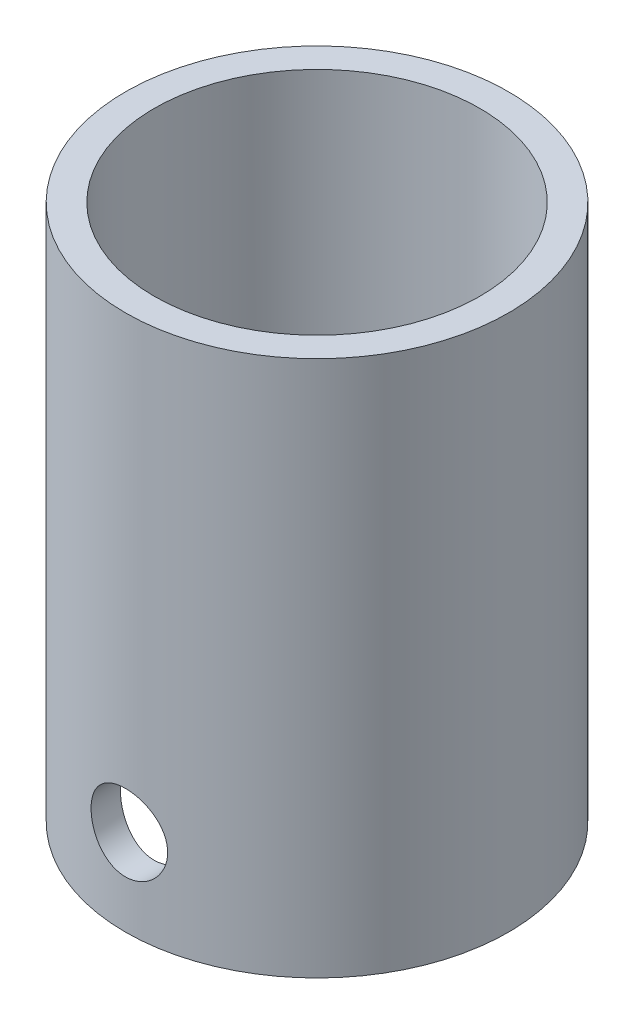
ISO-10303-21;
HEADER;
FILE_DESCRIPTION(('STEP AP214'),'2;1');
FILE_NAME('part.step','',(''),(''),'','','');
FILE_SCHEMA(('AUTOMOTIVE_DESIGN { 1 0 10303 214 1 1 1 1 }'));
ENDSEC;
DATA;
#1=APPLICATION_CONTEXT('core data for automotive mechanical design processes');
#2=APPLICATION_PROTOCOL_DEFINITION('international standard','automotive_design',2000,#1);
#3=PRODUCT_CONTEXT('',#1,'mechanical');
#4=PRODUCT('Part','Part','',(#3));
#5=PRODUCT_RELATED_PRODUCT_CATEGORY('part','',(#4));
#6=PRODUCT_DEFINITION_FORMATION('','',#4);
#7=PRODUCT_DEFINITION_CONTEXT('part definition',#1,'design');
#8=PRODUCT_DEFINITION('design','',#6,#7);
#9=PRODUCT_DEFINITION_SHAPE('','',#8);
#10=(LENGTH_UNIT() NAMED_UNIT(*) SI_UNIT(.MILLI.,.METRE.));
#11=(NAMED_UNIT(*) PLANE_ANGLE_UNIT() SI_UNIT($,.RADIAN.));
#12=(NAMED_UNIT(*) SI_UNIT($,.STERADIAN.) SOLID_ANGLE_UNIT());
#13=UNCERTAINTY_MEASURE_WITH_UNIT(LENGTH_MEASURE(1.E-05),#10,'distance_accuracy_value','');
#14=(GEOMETRIC_REPRESENTATION_CONTEXT(3) GLOBAL_UNCERTAINTY_ASSIGNED_CONTEXT((#13)) GLOBAL_UNIT_ASSIGNED_CONTEXT((#10,
#11,#12)) REPRESENTATION_CONTEXT('',''));
#15=CARTESIAN_POINT('',(0.,0.,0.));
#16=DIRECTION('',(0.,0.,1.));
#17=DIRECTION('',(1.,0.,0.));
#18=AXIS2_PLACEMENT_3D('',#15,#16,#17);
#19=CARTESIAN_POINT('',(0.,28.,0.));
#20=DIRECTION('',(0.,-1.,0.));
#21=DIRECTION('',(0.,0.,-1.));
#22=AXIS2_PLACEMENT_3D('',#19,#20,#21);
#23=CYLINDRICAL_SURFACE('',#22,10.);
#24=CARTESIAN_POINT('',(0.,28.,0.));
#25=DIRECTION('',(0.,1.,0.));
#26=DIRECTION('',(0.,0.,1.));
#27=AXIS2_PLACEMENT_3D('',#24,#25,#26);
#28=CIRCLE('',#27,10.);
#29=CARTESIAN_POINT('',(0.,28.,10.));
#30=VERTEX_POINT('',#29);
#31=EDGE_CURVE('E10',#30,#30,#28,.T.);
#32=ORIENTED_EDGE('',*,*,#31,.F.);
#33=EDGE_LOOP('',(#32));
#34=FACE_BOUND('',#33,.T.);
#35=CARTESIAN_POINT('',(0.,0.,0.));
#36=DIRECTION('',(0.,1.,0.));
#37=DIRECTION('',(0.,0.,1.));
#38=AXIS2_PLACEMENT_3D('',#35,#36,#37);
#39=CIRCLE('',#38,10.);
#40=CARTESIAN_POINT('',(0.,0.,10.));
#41=VERTEX_POINT('',#40);
#42=EDGE_CURVE('E45',#41,#41,#39,.T.);
#43=ORIENTED_EDGE('',*,*,#42,.T.);
#44=EDGE_LOOP('',(#43));
#45=FACE_BOUND('',#44,.T.);
#46=CARTESIAN_POINT('',(0.,2.5,10.));
#47=CARTESIAN_POINT('',(0.111153813585266,2.50000408899669,9.99999795161742));
#48=CARTESIAN_POINT('',(0.222359320403045,2.50929768593529,9.99812770356462));
#49=CARTESIAN_POINT('',(0.441627015378038,2.54619700023049,9.99084731246463));
#50=CARTESIAN_POINT('',(0.549686635082711,2.57381726560302,9.98543435720372));
#51=CARTESIAN_POINT('',(0.759460610526626,2.64648254724158,9.97167298556573));
#52=CARTESIAN_POINT('',(0.861180935866268,2.69151087368938,9.96332738153436));
#53=CARTESIAN_POINT('',(1.05561597772845,2.79766449502259,9.94460796070629));
#54=CARTESIAN_POINT('',(1.14833123015162,2.85878883121441,9.93423426471414));
#55=CARTESIAN_POINT('',(1.32338695462973,2.99627698858287,9.9124433065994));
#56=CARTESIAN_POINT('',(1.40558790231705,3.0728167107824,9.90101491008695));
#57=CARTESIAN_POINT('',(1.55607351321606,3.2385848327834,9.87848360905177));
#58=CARTESIAN_POINT('',(1.62435708954085,3.32781422267024,9.86738073000848));
#59=CARTESIAN_POINT('',(1.74566350669524,3.51743238602375,9.8466488362523));
#60=CARTESIAN_POINT('',(1.79854187773173,3.61791528759272,9.83703414729892));
#61=CARTESIAN_POINT('',(1.88661133316062,3.82656363800816,9.82052536116836));
#62=CARTESIAN_POINT('',(1.92180416487448,3.93472832669269,9.81363099523923));
#63=CARTESIAN_POINT('',(1.97305059976965,4.15416872781583,9.80345610504409));
#64=CARTESIAN_POINT('',(1.98934899591755,4.26538508828445,9.80012940214375));
#65=CARTESIAN_POINT('',(2.00310425545224,4.48901964272869,9.79732750121254));
#66=CARTESIAN_POINT('',(2.000563045427,4.60143771264029,9.79785190935681));
#67=CARTESIAN_POINT('',(1.97690914620364,4.82249357604201,9.80265102296369));
#68=CARTESIAN_POINT('',(1.95607708048781,4.93116281125463,9.80686905717527));
#69=CARTESIAN_POINT('',(1.8968757692461,5.143432153326,9.81849092320002));
#70=CARTESIAN_POINT('',(1.85850568620136,5.24703201783802,9.82589490715558));
#71=CARTESIAN_POINT('',(1.76504956734944,5.4470305234072,9.84311237000816));
#72=CARTESIAN_POINT('',(1.70985230246423,5.54337575913834,9.85294179627409));
#73=CARTESIAN_POINT('',(1.58438714914536,5.72554169994563,9.87389237546124));
#74=CARTESIAN_POINT('',(1.51411752871366,5.81136119370231,9.88501367676732));
#75=CARTESIAN_POINT('',(1.35899986912117,5.97165880491387,9.90754042482924));
#76=CARTESIAN_POINT('',(1.27391232242489,6.04590513571826,9.9189473842181));
#77=CARTESIAN_POINT('',(1.09237004812402,6.17910769260245,9.94057697428817));
#78=CARTESIAN_POINT('',(0.995915174758778,6.23806372258716,9.95079958977947));
#79=CARTESIAN_POINT('',(0.794118773757841,6.33905501845195,9.96893380321774));
#80=CARTESIAN_POINT('',(0.6887636391706,6.38106378728907,9.97684177696544));
#81=CARTESIAN_POINT('',(0.472297952897329,6.44672094807713,9.98942817975716));
#82=CARTESIAN_POINT('',(0.361188100144898,6.47037156414726,9.99410700001063));
#83=CARTESIAN_POINT('',(0.1383588112543,6.49831290758855,9.99965343733735));
#84=CARTESIAN_POINT('',(0.0266806566511517,6.50292083908054,10.0005834930494));
#85=CARTESIAN_POINT('',(-0.195849868385429,6.49350028211564,9.99870103860205));
#86=CARTESIAN_POINT('',(-0.306702284887587,6.47947284129481,9.99588873882892));
#87=CARTESIAN_POINT('',(-0.523411319893082,6.43344325291209,9.98687664016035));
#88=CARTESIAN_POINT('',(-0.629303896679806,6.40160386300419,9.98070752808413));
#89=CARTESIAN_POINT('',(-0.834247254999334,6.32103203468838,9.96567104122065));
#90=CARTESIAN_POINT('',(-0.933297523275079,6.27229833064634,9.95680346428453));
#91=CARTESIAN_POINT('',(-1.12308234737244,6.15863501869737,9.93719823066589));
#92=CARTESIAN_POINT('',(-1.21370025350438,6.09351443792211,9.92643900874104));
#93=CARTESIAN_POINT('',(-1.38283603823841,5.94918161758544,9.90429469659765));
#94=CARTESIAN_POINT('',(-1.46135261786153,5.86996786720027,9.89290953936776));
#95=CARTESIAN_POINT('',(-1.60528118154835,5.69825329621775,9.8705860711393));
#96=CARTESIAN_POINT('',(-1.67047540489731,5.60556851155733,9.85965720466609));
#97=CARTESIAN_POINT('',(-1.78437084010241,5.41037727728664,9.83968383592389));
#98=CARTESIAN_POINT('',(-1.8330727118458,5.3078712208529,9.83063925826685));
#99=CARTESIAN_POINT('',(-1.91230368316392,5.0964635077009,9.81553481168766));
#100=CARTESIAN_POINT('',(-1.9429269995821,4.98759831757936,9.80945949744373));
#101=CARTESIAN_POINT('',(-1.98541730325439,4.76613309301819,9.8009487358405));
#102=CARTESIAN_POINT('',(-1.99728673645022,4.65353354758131,9.79851281382223));
#103=CARTESIAN_POINT('',(-2.00184182173494,4.42998227091136,9.79758299262758));
#104=CARTESIAN_POINT('',(-1.99487157614179,4.31903770214598,9.79901838378602));
#105=CARTESIAN_POINT('',(-1.96270460820012,4.09993670018995,9.80551146969228));
#106=CARTESIAN_POINT('',(-1.9375080322586,3.99178024461039,9.81056913534338));
#107=CARTESIAN_POINT('',(-1.86975713699791,3.78154457751891,9.82370528438317));
#108=CARTESIAN_POINT('',(-1.82724501343469,3.67945127899517,9.83177642037661));
#109=CARTESIAN_POINT('',(-1.72610928920321,3.48379255853112,9.85003429948341));
#110=CARTESIAN_POINT('',(-1.66748433754976,3.39022785254972,9.86022121997788));
#111=CARTESIAN_POINT('',(-1.53461182957283,3.21256885569937,9.88177921046451));
#112=CARTESIAN_POINT('',(-1.46011577447036,3.12866246946481,9.89316745819399));
#113=CARTESIAN_POINT('',(-1.29812873802628,2.97442758894166,9.91572163743909));
#114=CARTESIAN_POINT('',(-1.21063477430667,2.90410221936546,9.92688751726369));
#115=CARTESIAN_POINT('',(-1.02403525817649,2.77833071210711,9.94787664775943));
#116=CARTESIAN_POINT('',(-0.924817768859669,2.72304799343995,9.95768462438492));
#117=CARTESIAN_POINT('',(-0.718332721881464,2.63002775480682,9.9747025017));
#118=CARTESIAN_POINT('',(-0.611072521726252,2.59227442093502,9.98191474277232));
#119=CARTESIAN_POINT('',(-0.419642977847558,2.54269610391057,9.99152745190741));
#120=CARTESIAN_POINT('',(-0.336563328027569,2.52671361258448,9.99468606316904));
#121=CARTESIAN_POINT('',(-0.168999050420134,2.50536417528327,9.99892308279786));
#122=CARTESIAN_POINT('',(-0.084514467497238,2.49999689098046,10.0000015574631));
#123=CARTESIAN_POINT('',(0.,2.5,10.));
#124=B_SPLINE_CURVE_WITH_KNOTS('',3,(#46,#47,#48,#49,#50,#51,#52,#53,#54,#55,#56,#57,#58,#59,
#60,#61,#62,#63,#64,#65,#66,#67,#68,#69,#70,#71,#72,#73,#74,#75,#76,#77,#78,#79,#80,#81,#82,#83,
#84,#85,#86,#87,#88,#89,#90,#91,#92,#93,#94,#95,#96,#97,#98,#99,#100,#101,#102,#103,#104,#105,
#106,#107,#108,#109,#110,#111,#112,#113,#114,#115,#116,#117,#118,#119,#120,#121,#122,#123),
.UNSPECIFIED.,.T.,.F.,(4,2,2,2,2,2,2,2,2,2,2,2,2,2,2,2,2,2,2,2,2,2,2,2,2,2,2,2,2,2,2,2,2,2,2,2,
2,2,4),(0.,0.333152261322517,0.666569301382646,0.999667470500683,1.33274580446173,
1.66986534022437,2.00701119349473,2.34722390011845,2.68740298730395,3.02312370207175,
3.3588100856245,3.68943454012557,4.02007478507459,4.35294980407185,4.68586309499341,
5.02476504982701,5.3636713507964,5.70310549708048,6.04249851396072,6.3762147135253,
6.70991215315735,7.04060907901447,7.37133078432045,7.70610132066717,8.0409077669186,
8.38081257158451,8.72070377446933,9.05880762065446,9.39686736660829,9.72879445135402,
10.0607188698522,10.3918392250622,10.7229873516373,11.0597615247829,11.3966130906586,
11.7369899335127,12.0770591103504,12.3303755057979,12.5836838274199),.UNSPECIFIED.);
#125=CARTESIAN_POINT('',(0.,2.5,10.));
#126=VERTEX_POINT('',#125);
#127=EDGE_CURVE('E60',#126,#126,#124,.T.);
#128=ORIENTED_EDGE('',*,*,#127,.F.);
#129=EDGE_LOOP('',(#128));
#130=FACE_BOUND('',#129,.T.);
#131=CARTESIAN_POINT('',(-7.48528137423854,4.5,-6.63103029313527));
#132=CARTESIAN_POINT('',(-7.48528534175998,4.38887124901769,-6.63102783998698));
#133=CARTESIAN_POINT('',(-7.49158334528495,4.27769075333332,-6.62393734757771));
#134=CARTESIAN_POINT('',(-7.51644880886374,4.05847498971374,-6.5957060227524));
#135=CARTESIAN_POINT('',(-7.5350260863981,3.95044231072804,-6.57455394779309));
#136=CARTESIAN_POINT('',(-7.58344314757943,3.74072539329158,-6.51864612095654));
#137=CARTESIAN_POINT('',(-7.61327172844751,3.63903495693482,-6.48390389934418));
#138=CARTESIAN_POINT('',(-7.68270031218905,3.44465031060609,-6.4014846991896));
#139=CARTESIAN_POINT('',(-7.72229976968392,3.3519555989242,-6.35380844256844));
#140=CARTESIAN_POINT('',(-7.80998626971811,3.17687799229228,-6.24571896220299));
#141=CARTESIAN_POINT('',(-7.85817460893679,3.09464082423205,-6.18515183606364));
#142=CARTESIAN_POINT('',(-7.96055444821893,2.94408493284204,-6.05281413137031));
#143=CARTESIAN_POINT('',(-8.01474636868047,2.87576718516562,-5.98104276810052));
#144=CARTESIAN_POINT('',(-8.12737189791142,2.75442396474308,-5.8270907975124));
#145=CARTESIAN_POINT('',(-8.18583836092761,2.70153697236672,-5.74482491398905));
#146=CARTESIAN_POINT('',(-8.30425420720004,2.61345012590373,-5.57227926950718));
#147=CARTESIAN_POINT('',(-8.36420345109486,2.57824861619802,-5.48200025962551));
#148=CARTESIAN_POINT('',(-8.48256628187177,2.52698561276075,-5.2969770487642));
#149=CARTESIAN_POINT('',(-8.54098969497207,2.51067804485799,-5.20230735291124));
#150=CARTESIAN_POINT('',(-8.65517104001714,2.49689809632337,-5.01004085783569));
#151=CARTESIAN_POINT('',(-8.71092922829,2.49942390070836,-4.91244434157533));
#152=CARTESIAN_POINT('',(-8.81741985387418,2.52305236043111,-4.718598216164));
#153=CARTESIAN_POINT('',(-8.86821255411409,2.5438899543357,-4.62234921858777));
#154=CARTESIAN_POINT('',(-8.96452966077534,2.60313006491778,-4.43266624795527));
#155=CARTESIAN_POINT('',(-9.01005385631614,2.64153328438375,-4.33923238769013));
#156=CARTESIAN_POINT('',(-9.09537513880908,2.73506008029454,-4.15743998648219));
#157=CARTESIAN_POINT('',(-9.13513432591896,2.79028750220977,-4.06911714055085));
#158=CARTESIAN_POINT('',(-9.20821530994478,2.9158181544732,-3.90092201509347));
#159=CARTESIAN_POINT('',(-9.24153636529377,2.98612311954103,-3.82105070952468));
#160=CARTESIAN_POINT('',(-9.30217181332925,3.14126724421694,-3.67100437315703));
#161=CARTESIAN_POINT('',(-9.32937138819979,3.22633837345918,-3.60102261125924));
#162=CARTESIAN_POINT('',(-9.37709734965357,3.4078328849015,-3.474853826831));
#163=CARTESIAN_POINT('',(-9.39762361002291,3.50425648176639,-3.41866706521341));
#164=CARTESIAN_POINT('',(-9.43221230508039,3.70604166364361,-3.32205095874137));
#165=CARTESIAN_POINT('',(-9.44626081247998,3.81142193527932,-3.2816555937798));
#166=CARTESIAN_POINT('',(-9.46799929036252,4.02794264744798,-3.21840323591697));
#167=CARTESIAN_POINT('',(-9.47569008956747,4.13908233523817,-3.19554395722938));
#168=CARTESIAN_POINT('',(-9.48475102109938,4.36192971599809,-3.16854850502821));
#169=CARTESIAN_POINT('',(-9.48622705602403,4.47359514862068,-3.16409864911803));
#170=CARTESIAN_POINT('',(-9.48317145948521,4.69609644639937,-3.17324464283868));
#171=CARTESIAN_POINT('',(-9.47864016868685,4.80693235823773,-3.18683946918668));
#172=CARTESIAN_POINT('',(-9.4635759201706,5.02353728058447,-3.23129498477573));
#173=CARTESIAN_POINT('',(-9.45310092847205,5.12934468607153,-3.26198886338978));
#174=CARTESIAN_POINT('',(-9.42605606298382,5.33412655805748,-3.33933155798597));
#175=CARTESIAN_POINT('',(-9.40948568710714,5.43310046087144,-3.38598168828908));
#176=CARTESIAN_POINT('',(-9.36982461615306,5.62282621990032,-3.49424394529494));
#177=CARTESIAN_POINT('',(-9.34665174851429,5.71345409260165,-3.55604316551692));
#178=CARTESIAN_POINT('',(-9.29373503106753,5.88261662400183,-3.69212768717379));
#179=CARTESIAN_POINT('',(-9.26399050488958,5.96115003649851,-3.76641427364832));
#180=CARTESIAN_POINT('',(-9.19739828052146,6.10512511837115,-3.92625271545884));
#181=CARTESIAN_POINT('',(-9.16044855075147,6.17034730929999,-4.01195999832512));
#182=CARTESIAN_POINT('',(-9.07996514199228,6.28429176299917,-4.19092414825983));
#183=CARTESIAN_POINT('',(-9.03643173960933,6.33301471868956,-4.28418069807708));
#184=CARTESIAN_POINT('',(-8.94361421348614,6.41225774349327,-4.47469754138951));
#185=CARTESIAN_POINT('',(-8.89436465530381,6.4428810364525,-4.57193168167307));
#186=CARTESIAN_POINT('',(-8.79090146439732,6.48538249532769,-4.76784145683866));
#187=CARTESIAN_POINT('',(-8.73668843039053,6.49726291895136,-4.86651691665839));
#188=CARTESIAN_POINT('',(-8.62570227402597,6.50185396192578,-5.06058702858922));
#189=CARTESIAN_POINT('',(-8.56899011594965,6.49489456091245,-5.15600889159286));
#190=CARTESIAN_POINT('',(-8.45387517302791,6.46273209890434,-5.34266042188408));
#191=CARTESIAN_POINT('',(-8.39547240944914,6.43752926730374,-5.43389014186863));
#192=CARTESIAN_POINT('',(-8.27909947731719,6.36974201581682,-5.60959899896653));
#193=CARTESIAN_POINT('',(-8.22112862712679,6.32719724373805,-5.69409301216203));
#194=CARTESIAN_POINT('',(-8.1076009014851,6.22597551733778,-5.85461219608376));
#195=CARTESIAN_POINT('',(-8.05204421719705,6.167297288191,-5.93063669690304));
#196=CARTESIAN_POINT('',(-7.94464166048002,6.03436122587743,-6.07378096238983));
#197=CARTESIAN_POINT('',(-7.89287011135562,5.95986732723245,-6.14073728630626));
#198=CARTESIAN_POINT('',(-7.79624083430938,5.79789951980246,-6.26296368324757));
#199=CARTESIAN_POINT('',(-7.75138474674507,5.71042254104015,-6.31823098477187));
#200=CARTESIAN_POINT('',(-7.67020872599979,5.52384136661914,-6.41654249126745));
#201=CARTESIAN_POINT('',(-7.6339859446098,5.42462207775749,-6.45944862251816));
#202=CARTESIAN_POINT('',(-7.57255381704089,5.2181344534798,-6.53136153089205));
#203=CARTESIAN_POINT('',(-7.5473344816038,5.11087352262562,-6.56038091714505));
#204=CARTESIAN_POINT('',(-7.51409006204026,4.91947508911425,-6.59840148541168));
#205=CARTESIAN_POINT('',(-7.50331849904027,4.83642916097209,-6.61062253087502));
#206=CARTESIAN_POINT('',(-7.48891277009779,4.66893209089773,-6.6269377271026));
#207=CARTESIAN_POINT('',(-7.48527835809586,4.58448099751106,-6.63103215803893));
#208=CARTESIAN_POINT('',(-7.48528137423854,4.5,-6.63103029313527));
#209=B_SPLINE_CURVE_WITH_KNOTS('',3,(#131,#132,#133,#134,#135,#136,#137,#138,#139,#140,#141,
#142,#143,#144,#145,#146,#147,#148,#149,#150,#151,#152,#153,#154,#155,#156,#157,#158,#159,#160,
#161,#162,#163,#164,#165,#166,#167,#168,#169,#170,#171,#172,#173,#174,#175,#176,#177,#178,#179,
#180,#181,#182,#183,#184,#185,#186,#187,#188,#189,#190,#191,#192,#193,#194,#195,#196,#197,#198,
#199,#200,#201,#202,#203,#204,#205,#206,#207,#208),.UNSPECIFIED.,.T.,.F.,(4,2,2,2,2,2,2,2,2,2,2,
2,2,2,2,2,2,2,2,2,2,2,2,2,2,2,2,2,2,2,2,2,2,2,2,2,2,2,4),(0.,0.333076927738856,
0.666420478568593,0.999432995881172,1.33242692971973,1.66964505096873,2.00688680070844,
2.347068008749,2.6872173649312,3.02288497766161,3.35852024232496,3.68937579267075,
4.020244581475,4.35319848444606,4.68619071540132,5.02498693524967,5.36378956245441,
5.70331726345553,6.0428007003205,6.37647515609187,6.71013069056843,7.04058683566638,
7.37107020708797,7.70586119549042,8.04068665740418,8.38065203466902,8.7206031326021,
9.058596271573,9.39654869383256,9.72862034829372,10.0606878273351,10.392000341509,
10.7233390426937,11.0600230405119,11.3967867777956,11.7371779715921,12.077259501804,
12.3304760727632,12.5836839137096),.UNSPECIFIED.);
#210=CARTESIAN_POINT('',(-7.48528137423854,4.5,-6.63103029313527));
#211=VERTEX_POINT('',#210);
#212=EDGE_CURVE('E61',#211,#211,#209,.T.);
#213=ORIENTED_EDGE('',*,*,#212,.F.);
#214=EDGE_LOOP('',(#213));
#215=FACE_BOUND('',#214,.T.);
#216=ADVANCED_FACE('F33',(#34,#45,#130,#215),#23,.T.);
#217=CARTESIAN_POINT('',(0.,28.,0.));
#218=DIRECTION('',(0.,-1.,0.));
#219=DIRECTION('',(0.,0.,-1.));
#220=AXIS2_PLACEMENT_3D('',#217,#218,#219);
#221=CYLINDRICAL_SURFACE('',#220,8.5);
#222=CARTESIAN_POINT('',(-2.,4.5,8.26135582092915));
#223=CARTESIAN_POINT('',(-1.99999651213142,4.38934060606522,8.26135802551907));
#224=CARTESIAN_POINT('',(-1.99078460869867,4.2786410639465,8.26360346671518));
#225=CARTESIAN_POINT('',(-1.95423010640727,4.0604059004523,8.27232284181465));
#226=CARTESIAN_POINT('',(-1.92687572201627,3.95287238321235,8.27879952433259));
#227=CARTESIAN_POINT('',(-1.85495833916342,3.74415748951898,8.29520817322454));
#228=CARTESIAN_POINT('',(-1.81041592745925,3.64296868167489,8.30513600462058));
#229=CARTESIAN_POINT('',(-1.70544786676207,3.44949317176089,8.32732327781825));
#230=CARTESIAN_POINT('',(-1.64502202368064,3.3572065784909,8.33958274811096));
#231=CARTESIAN_POINT('',(-1.50874395737542,3.18235365829531,8.36531956073526));
#232=CARTESIAN_POINT('',(-1.43263940544672,3.09998654824363,8.37881451302673));
#233=CARTESIAN_POINT('',(-1.26770837089036,2.94906074338188,8.40534831650967));
#234=CARTESIAN_POINT('',(-1.17888080073702,2.88050323018167,8.41838712859297));
#235=CARTESIAN_POINT('',(-0.989674445059699,2.75834072571523,8.44273291558597));
#236=CARTESIAN_POINT('',(-0.889167331716042,2.70492946601408,8.45401668490385));
#237=CARTESIAN_POINT('',(-0.680292851147021,2.61583219764843,8.47338106966651));
#238=CARTESIAN_POINT('',(-0.57192650986238,2.58014388019347,8.48146210230821));
#239=CARTESIAN_POINT('',(-0.352484083492059,2.5281380840323,8.49338603276858));
#240=CARTESIAN_POINT('',(-0.241492127800714,2.51148282804643,8.49730274393597));
#241=CARTESIAN_POINT('',(-0.018225030706266,2.49695770246422,8.5007132285085));
#242=CARTESIAN_POINT('',(0.0940499398834185,2.49908536065663,8.50020758398515));
#243=CARTESIAN_POINT('',(0.314360214367524,2.52181852943656,8.49488598954047));
#244=CARTESIAN_POINT('',(0.422435471794067,2.54205970242985,8.49015503180202));
#245=CARTESIAN_POINT('',(0.633610486394558,2.59986215756216,8.47701229030309));
#246=CARTESIAN_POINT('',(0.736709996545196,2.63742429863368,8.4686003240055));
#247=CARTESIAN_POINT('',(0.935991732340313,2.72911044611021,8.44890746429804));
#248=CARTESIAN_POINT('',(1.03211005820156,2.78336818897358,8.43760353340958));
#249=CARTESIAN_POINT('',(1.21400773064364,2.90680479441513,8.41335949203644));
#250=CARTESIAN_POINT('',(1.29978546199507,2.97598598338123,8.40041912658134));
#251=CARTESIAN_POINT('',(1.46073740692322,3.1292738959099,8.37395173368035));
#252=CARTESIAN_POINT('',(1.5356073116359,3.21369931213831,8.36041808098271));
#253=CARTESIAN_POINT('',(1.67018914933383,3.39404880922499,8.33457724865037));
#254=CARTESIAN_POINT('',(1.72990052955636,3.48997330921503,8.32227011375115));
#255=CARTESIAN_POINT('',(1.83263569425182,3.69114356610699,8.30025483883978));
#256=CARTESIAN_POINT('',(1.87559393355672,3.79642399457595,8.29055695223904));
#257=CARTESIAN_POINT('',(1.94311185259453,4.01299374414165,8.27499423537924));
#258=CARTESIAN_POINT('',(1.96767496625017,4.1242819395738,8.26912868974138));
#259=CARTESIAN_POINT('',(1.99721658627362,4.34690614330104,8.2620429264625));
#260=CARTESIAN_POINT('',(2.0026417025433,4.45817958724126,8.2607167978904));
#261=CARTESIAN_POINT('',(1.99496945983579,4.68004123147359,8.2625729788493));
#262=CARTESIAN_POINT('',(1.98187359228533,4.79062948622122,8.26575492536164));
#263=CARTESIAN_POINT('',(1.93792079494132,5.00637384056307,8.27616794802863));
#264=CARTESIAN_POINT('',(1.90731701127267,5.11158456172536,8.28334127338574));
#265=CARTESIAN_POINT('',(1.82949455925487,5.31538400383334,8.30087529838408));
#266=CARTESIAN_POINT('',(1.78227410097005,5.41397201002213,8.31123634138874));
#267=CARTESIAN_POINT('',(1.67160019569909,5.60363945560846,8.33420606476226));
#268=CARTESIAN_POINT('',(1.60787579020965,5.69455629231861,8.34685107923934));
#269=CARTESIAN_POINT('',(1.46635124133186,5.86457015229048,8.37287165047455));
#270=CARTESIAN_POINT('',(1.38854906051416,5.9436654616325,8.38624731278103));
#271=CARTESIAN_POINT('',(1.21904159311278,6.08956329893577,8.41257627107509));
#272=CARTESIAN_POINT('',(1.1270693658092,6.15605901418308,8.42551392351249));
#273=CARTESIAN_POINT('',(0.9330024087962,6.27265857169769,8.44920397895731));
#274=CARTESIAN_POINT('',(0.830908186161164,6.32276323455573,8.45995649134991));
#275=CARTESIAN_POINT('',(0.620174428647754,6.40475066859317,8.47799969987942));
#276=CARTESIAN_POINT('',(0.511585474827779,6.43675801311384,8.48531400267632));
#277=CARTESIAN_POINT('',(0.290377680875247,6.48202433584919,8.4957594351961));
#278=CARTESIAN_POINT('',(0.177759527681944,6.49528649446524,8.49889127453152));
#279=CARTESIAN_POINT('',(-0.0454132349608412,6.50252436765579,8.50059376343422));
#280=CARTESIAN_POINT('',(-0.155952496494861,6.49695534527635,8.49927208409503));
#281=CARTESIAN_POINT('',(-0.374472612307284,6.46771982476974,8.49245087752118));
#282=CARTESIAN_POINT('',(-0.482453527305839,6.44405375660487,8.48695144954443));
#283=CARTESIAN_POINT('',(-0.692375275607766,6.37952800396427,8.47240518313697));
#284=CARTESIAN_POINT('',(-0.794339912345044,6.33874210346285,8.46337357914003));
#285=CARTESIAN_POINT('',(-0.990034413383736,6.24120318473554,8.4427202414696));
#286=CARTESIAN_POINT('',(-1.0837633479488,6.18444836679452,8.43109821588335));
#287=CARTESIAN_POINT('',(-1.26251541374459,6.05514752181073,8.40621095484215));
#288=CARTESIAN_POINT('',(-1.34730688519144,5.98228700523574,8.39291565878279));
#289=CARTESIAN_POINT('',(-1.50361474274856,5.8234652775459,8.36632793628279));
#290=CARTESIAN_POINT('',(-1.57512784802525,5.73750083822798,8.35303551135975));
#291=CARTESIAN_POINT('',(-1.7039641905749,5.55325419105994,8.3277185743066));
#292=CARTESIAN_POINT('',(-1.76104180104336,5.454796742379,8.31571778057629));
#293=CARTESIAN_POINT('',(-1.85774896237649,5.24941962807406,8.29465107082965));
#294=CARTESIAN_POINT('',(-1.89739223228257,5.14250669450059,8.28558284867228));
#295=CARTESIAN_POINT('',(-1.95162562110889,4.94635777839566,8.27295300343949));
#296=CARTESIAN_POINT('',(-1.96972884801275,4.85812519160404,8.26863485981594));
#297=CARTESIAN_POINT('',(-1.99391706056427,4.6799371761256,8.26283546546791));
#298=CARTESIAN_POINT('',(-2.00000283613433,4.5899818610684,8.2613540282833));
#299=CARTESIAN_POINT('',(-2.,4.5,8.26135582092915));
#300=B_SPLINE_CURVE_WITH_KNOTS('',3,(#222,#223,#224,#225,#226,#227,#228,#229,#230,#231,#232,
#233,#234,#235,#236,#237,#238,#239,#240,#241,#242,#243,#244,#245,#246,#247,#248,#249,#250,#251,
#252,#253,#254,#255,#256,#257,#258,#259,#260,#261,#262,#263,#264,#265,#266,#267,#268,#269,#270,
#271,#272,#273,#274,#275,#276,#277,#278,#279,#280,#281,#282,#283,#284,#285,#286,#287,#288,#289,
#290,#291,#292,#293,#294,#295,#296,#297,#298,#299),.UNSPECIFIED.,.T.,.F.,(4,2,2,2,2,2,2,2,2,2,2,
2,2,2,2,2,2,2,2,2,2,2,2,2,2,2,2,2,2,2,2,2,2,2,2,2,2,2,4),(0.,0.331648075820016,
0.663511804751994,0.994979275421689,1.32645079666375,1.66374480145421,2.00106765435525,
2.34252829445511,2.68394444036211,3.01920253760057,3.35441650875302,3.68303582731533,
4.01167144359098,4.34301124658704,4.67440273889615,5.01375700079712,5.35312363563384,
5.69380500216445,6.03442275590301,6.36703716396686,6.69962478934048,7.02752088276254,
7.3554523077224,7.68915273563912,8.02290149758809,8.36395228018205,8.70498598602304,
9.0436426696936,9.38224188828881,9.71271422831179,10.0431787169852,10.3722333431968,
10.7013250691031,11.037522189861,11.3738022683612,11.7154685736477,12.0568655393505,
12.3265604273148,12.5962375873002),.UNSPECIFIED.);
#301=CARTESIAN_POINT('',(-2.,4.5,8.26135582092915));
#302=VERTEX_POINT('',#301);
#303=EDGE_CURVE('E55',#302,#302,#300,.T.);
#304=ORIENTED_EDGE('',*,*,#303,.T.);
#305=EDGE_LOOP('',(#304));
#306=FACE_BOUND('',#305,.T.);
#307=CARTESIAN_POINT('',(0.,28.,0.));
#308=DIRECTION('',(0.,1.,0.));
#309=DIRECTION('',(0.,0.,1.));
#310=AXIS2_PLACEMENT_3D('',#307,#308,#309);
#311=CIRCLE('',#310,8.5);
#312=CARTESIAN_POINT('',(0.,28.,8.5));
#313=VERTEX_POINT('',#312);
#314=EDGE_CURVE('E50',#313,#313,#311,.T.);
#315=ORIENTED_EDGE('',*,*,#314,.T.);
#316=EDGE_LOOP('',(#315));
#317=FACE_BOUND('',#316,.T.);
#318=CARTESIAN_POINT('',(0.,0.,0.));
#319=DIRECTION('',(0.,1.,0.));
#320=DIRECTION('',(0.,0.,1.));
#321=AXIS2_PLACEMENT_3D('',#318,#319,#320);
#322=CIRCLE('',#321,8.5);
#323=CARTESIAN_POINT('',(0.,0.,8.5));
#324=VERTEX_POINT('',#323);
#325=EDGE_CURVE('E53',#324,#324,#322,.T.);
#326=ORIENTED_EDGE('',*,*,#325,.F.);
#327=EDGE_LOOP('',(#326));
#328=FACE_BOUND('',#327,.T.);
#329=CARTESIAN_POINT('',(-6.15454401062707,4.5,-5.86272871803348));
#330=CARTESIAN_POINT('',(-6.15454766379223,4.38934060606522,-5.86272679974565));
#331=CARTESIAN_POINT('',(-6.16109822462714,4.2786410639465,-5.85587177795373));
#332=CARTESIAN_POINT('',(-6.18692667611411,4.0604059004523,-5.82857433789642));
#333=CARTESIAN_POINT('',(-6.20621283990239,3.95287238321235,-5.8081230873679));
#334=CARTESIAN_POINT('',(-6.25638183811102,3.74415748951898,-5.75404513128961));
#335=CARTESIAN_POINT('',(-6.28725079815657,3.64296868167489,-5.720434186906));
#336=CARTESIAN_POINT('',(-6.35894957073505,3.44949317176089,-5.64062281635509));
#337=CARTESIAN_POINT('',(-6.39977950498619,3.3572065784909,-5.59442223634783));
#338=CARTESIAN_POINT('',(-6.49020727168389,3.18235365829531,-5.48927037526104));
#339=CARTESIAN_POINT('',(-6.5399465191555,3.09998654824363,-5.43010937609289));
#340=CARTESIAN_POINT('',(-6.64539098430893,2.94906074338188,-5.30054181203611));
#341=CARTESIAN_POINT('',(-6.70109671188492,2.88050323018167,-5.23013428576852));
#342=CARTESIAN_POINT('',(-6.81678395973464,2.75834072571523,-5.07844966869098));
#343=CARTESIAN_POINT('',(-6.87680954728619,2.70492946601408,-4.99704983993327));
#344=CARTESIAN_POINT('',(-6.99801683670383,2.61583219764843,-4.82584142593955));
#345=CARTESIAN_POINT('',(-7.05919838690267,2.58014388019347,-4.73603393779273));
#346=CARTESIAN_POINT('',(-7.17924602677947,2.5281380840323,-4.55195318711812));
#347=CARTESIAN_POINT('',(-7.23813397599539,2.51148282804643,-4.4577896894574));
#348=CARTESIAN_POINT('',(-7.35272109082164,2.49695770246422,-4.26613995383066));
#349=CARTESIAN_POINT('',(-7.40842067511397,2.49908536065663,-4.16865415482917));
#350=CARTESIAN_POINT('',(-7.5139671763783,2.52181852943656,-3.97519906318887));
#351=CARTESIAN_POINT('',(-7.56390767550584,2.54205970242985,-3.87923766586772));
#352=CARTESIAN_POINT('',(-7.65811323479265,2.59986215756216,-3.68978336782968));
#353=CARTESIAN_POINT('',(-7.70237801335847,2.63742429863368,-3.5962905897727));
#354=CARTESIAN_POINT('',(-7.78496436447621,2.72911044611021,-3.41386111421014));
#355=CARTESIAN_POINT('',(-7.8232340360948,2.78336818897358,-3.32496823680084));
#356=CARTESIAN_POINT('',(-7.89318691659631,2.90680479441513,-3.15531821089017));
#357=CARTESIAN_POINT('',(-7.92486909705365,2.97598598338123,-3.07456233373329));
#358=CARTESIAN_POINT('',(-7.98242363489352,3.1292738959099,-2.9219401641865));
#359=CARTESIAN_POINT('',(-8.00813810020771,3.21369931213831,-2.85033409837757));
#360=CARTESIAN_POINT('',(-8.05305020180194,3.39404880922499,-2.720862391877));
#361=CARTESIAN_POINT('',(-8.07224760044268,3.48997330921503,-2.66299725225966));
#362=CARTESIAN_POINT('',(-8.10454939544586,3.69114356610699,-2.56301835231572));
#363=CARTESIAN_POINT('',(-8.11762989893905,3.79642399457595,-2.52096648247546));
#364=CARTESIAN_POINT('',(-8.13791115030546,4.01299374414165,-2.45471289094815));
#365=CARTESIAN_POINT('',(-8.14511299560384,4.1242819395738,-2.43050783770739));
#366=CARTESIAN_POINT('',(-8.15374735461085,4.34690614330104,-2.4013811626587));
#367=CARTESIAN_POINT('',(-8.15531145171356,4.45817958724126,-2.39601980986462));
#368=CARTESIAN_POINT('',(-8.15308283022424,4.68004123147359,-2.40359225743277));
#369=CARTESIAN_POINT('',(-8.14929054296218,4.79062948622122,-2.41652458467224));
#370=CARTESIAN_POINT('',(-8.13633208644997,5.00637384056307,-2.45979533507304));
#371=CARTESIAN_POINT('',(-8.12724247660451,5.11158456172536,-2.48988565186057));
#372=CARTESIAN_POINT('',(-8.10351616167477,5.31538400383334,-2.56604888479194));
#373=CARTESIAN_POINT('',(-8.08887885898409,5.41397201002213,-2.61212352274727));
#374=CARTESIAN_POINT('',(-8.05343427030798,5.60363945560846,-2.71945479793472));
#375=CARTESIAN_POINT('',(-8.03252297133164,5.69455629231861,-2.78096425916817));
#376=CARTESIAN_POINT('',(-7.98429517260342,5.86457015229048,-2.91653839937308));
#377=CARTESIAN_POINT('',(-7.95697774554442,5.9436654616325,-2.99060489558427));
#378=CARTESIAN_POINT('',(-7.89502555858157,6.08956329893577,-3.15056714763206));
#379=CARTESIAN_POINT('',(-7.8602437806059,6.15605901418308,-3.2366862591383));
#380=CARTESIAN_POINT('',(-7.78372649193167,6.27265857169769,-3.41659820166911));
#381=CARTESIAN_POINT('',(-7.74199132950065,6.32276323455573,-3.51039064824697));
#382=CARTESIAN_POINT('',(-7.65225032769628,6.40475066859317,-3.70191303995329));
#383=CARTESIAN_POINT('',(-7.60429022281939,6.43675801311384,-3.79961098393022));
#384=CARTESIAN_POINT('',(-7.50273233575876,6.48202433584919,-3.99640526926811));
#385=CARTESIAN_POINT('',(-7.44913551158716,6.49528649446524,-4.09550137052851));
#386=CARTESIAN_POINT('',(-7.33902352890516,6.50252436765579,-4.28962589686127));
#387=CARTESIAN_POINT('',(-7.28260929025475,6.49695534527635,-4.3846948657957));
#388=CARTESIAN_POINT('',(-7.16744189417113,6.46771982476974,-4.57052823404026));
#389=CARTESIAN_POINT('',(-7.1086887923377,6.44405375660487,-4.66129273556452));
#390=CARTESIAN_POINT('',(-6.99113048194766,6.37952800396427,-4.8358171691971));
#391=CARTESIAN_POINT('',(-6.93232656508075,6.33874210346285,-4.91960533290076));
#392=CARTESIAN_POINT('',(-6.81659299946587,6.24120318473554,-5.07875507334597));
#393=CARTESIAN_POINT('',(-6.75966356278222,6.18444836679452,-5.15411569895585));
#394=CARTESIAN_POINT('',(-6.64873452959202,6.05514752181073,-5.29647589839334));
#395=CARTESIAN_POINT('',(-6.59482472973036,5.98228700523574,-5.3632598186609));
#396=CARTESIAN_POINT('',(-6.49364515783803,5.8234652775459,-5.48533253286648));
#397=CARTESIAN_POINT('',(-6.44637702753843,5.73750083822798,-5.54061848627809));
#398=CARTESIAN_POINT('',(-6.36003374562956,5.55325419105994,-5.63953556333018));
#399=CARTESIAN_POINT('',(-6.32110194815931,5.454796742379,-5.68296582711802));
#400=CARTESIAN_POINT('',(-6.25450406167801,5.24941962807406,-5.75618333068708));
#401=CARTESIAN_POINT('',(-6.22682911596952,5.14250669450059,-5.78598129843614));
#402=CARTESIAN_POINT('',(-6.18877465473889,4.94635777839566,-5.82663386827666));
#403=CARTESIAN_POINT('',(-6.17598341921178,4.85812519160404,-5.8401526508541));
#404=CARTESIAN_POINT('',(-6.15886689010407,4.6799371761256,-5.85820056022184));
#405=CARTESIAN_POINT('',(-6.15454104008305,4.5899818610684,-5.86273027787493));
#406=CARTESIAN_POINT('',(-6.15454401062707,4.5,-5.86272871803348));
#407=B_SPLINE_CURVE_WITH_KNOTS('',3,(#329,#330,#331,#332,#333,#334,#335,#336,#337,#338,#339,
#340,#341,#342,#343,#344,#345,#346,#347,#348,#349,#350,#351,#352,#353,#354,#355,#356,#357,#358,
#359,#360,#361,#362,#363,#364,#365,#366,#367,#368,#369,#370,#371,#372,#373,#374,#375,#376,#377,
#378,#379,#380,#381,#382,#383,#384,#385,#386,#387,#388,#389,#390,#391,#392,#393,#394,#395,#396,
#397,#398,#399,#400,#401,#402,#403,#404,#405,#406),.UNSPECIFIED.,.T.,.F.,(4,2,2,2,2,2,2,2,2,2,2,
2,2,2,2,2,2,2,2,2,2,2,2,2,2,2,2,2,2,2,2,2,2,2,2,2,2,2,4),(0.,0.331648075820016,
0.663511804751994,0.99497927542169,1.32645079666375,1.66374480145421,2.00106765435526,
2.34252829445511,2.68394444036211,3.01920253760057,3.35441650875302,3.68303582731533,
4.01167144359098,4.34301124658704,4.67440273889615,5.01375700079712,5.35312363563384,
5.69380500216445,6.03442275590301,6.36703716396686,6.69962478934048,7.02752088276254,
7.3554523077224,7.68915273563912,8.02290149758809,8.36395228018205,8.70498598602304,
9.0436426696936,9.38224188828881,9.71271422831179,10.0431787169852,10.3722333431968,
10.7013250691031,11.037522189861,11.3738022683612,11.7154685736477,12.0568655393505,
12.3265604273148,12.5962375873002),.UNSPECIFIED.);
#408=CARTESIAN_POINT('',(-6.15454401062707,4.5,-5.86272871803348));
#409=VERTEX_POINT('',#408);
#410=EDGE_CURVE('E37',#409,#409,#407,.T.);
#411=ORIENTED_EDGE('',*,*,#410,.T.);
#412=EDGE_LOOP('',(#411));
#413=FACE_BOUND('',#412,.T.);
#414=ADVANCED_FACE('F62',(#306,#317,#328,#413),#221,.F.);
#415=CARTESIAN_POINT('',(0.,28.,0.));
#416=DIRECTION('',(0.,1.,0.));
#417=DIRECTION('',(0.,0.,1.));
#418=AXIS2_PLACEMENT_3D('',#415,#416,#417);
#419=PLANE('',#418);
#420=ORIENTED_EDGE('',*,*,#31,.T.);
#421=EDGE_LOOP('',(#420));
#422=FACE_BOUND('',#421,.T.);
#423=ORIENTED_EDGE('',*,*,#314,.F.);
#424=EDGE_LOOP('',(#423));
#425=FACE_BOUND('',#424,.T.);
#426=ADVANCED_FACE('F89',(#422,#425),#419,.T.);
#427=CARTESIAN_POINT('',(0.,0.,0.));
#428=DIRECTION('',(0.,1.,0.));
#429=DIRECTION('',(0.,0.,1.));
#430=AXIS2_PLACEMENT_3D('',#427,#428,#429);
#431=PLANE('',#430);
#432=ORIENTED_EDGE('',*,*,#42,.F.);
#433=EDGE_LOOP('',(#432));
#434=FACE_BOUND('',#433,.T.);
#435=ORIENTED_EDGE('',*,*,#325,.T.);
#436=EDGE_LOOP('',(#435));
#437=FACE_BOUND('',#436,.T.);
#438=ADVANCED_FACE('F69',(#434,#437),#431,.F.);
#439=CARTESIAN_POINT('',(0.,4.5,10.));
#440=DIRECTION('',(0.,0.,-1.));
#441=DIRECTION('',(-1.,0.,0.));
#442=AXIS2_PLACEMENT_3D('',#439,#440,#441);
#443=CYLINDRICAL_SURFACE('',#442,2.);
#444=ORIENTED_EDGE('',*,*,#303,.F.);
#445=EDGE_LOOP('',(#444));
#446=FACE_BOUND('',#445,.T.);
#447=ORIENTED_EDGE('',*,*,#127,.T.);
#448=EDGE_LOOP('',(#447));
#449=FACE_BOUND('',#448,.T.);
#450=ADVANCED_FACE('F65',(#446,#449),#443,.F.);
#451=CARTESIAN_POINT('',(-11.8301270189222,4.5,-6.83012701892226));
#452=DIRECTION('',(0.866025403784436,0.,0.500000000000004));
#453=DIRECTION('',(0.500000000000004,0.,-0.866025403784436));
#454=AXIS2_PLACEMENT_3D('',#451,#452,#453);
#455=CYLINDRICAL_SURFACE('',#454,2.);
#456=ORIENTED_EDGE('',*,*,#410,.F.);
#457=EDGE_LOOP('',(#456));
#458=FACE_BOUND('',#457,.T.);
#459=ORIENTED_EDGE('',*,*,#212,.T.);
#460=EDGE_LOOP('',(#459));
#461=FACE_BOUND('',#460,.T.);
#462=ADVANCED_FACE('F68',(#458,#461),#455,.F.);
#463=CLOSED_SHELL('',(#216,#414,#426,#438,#450,#462));
#464=MANIFOLD_SOLID_BREP('B2',#463);
#465=ADVANCED_BREP_SHAPE_REPRESENTATION('',(#18,#464),#14);
#466=SHAPE_DEFINITION_REPRESENTATION(#9,#465);
ENDSEC;
END-ISO-10303-21;
